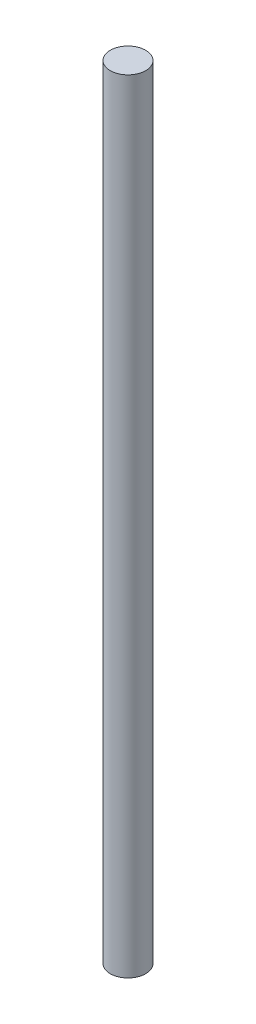
ISO-10303-21;
HEADER;
FILE_DESCRIPTION(('STEP AP214'),'2;1');
FILE_NAME('part.step','',(''),(''),'','','');
FILE_SCHEMA(('AUTOMOTIVE_DESIGN { 1 0 10303 214 1 1 1 1 }'));
ENDSEC;
DATA;
#1=APPLICATION_CONTEXT('core data for automotive mechanical design processes');
#2=APPLICATION_PROTOCOL_DEFINITION('international standard','automotive_design',2000,#1);
#3=PRODUCT_CONTEXT('',#1,'mechanical');
#4=PRODUCT('Part','Part','',(#3));
#5=PRODUCT_RELATED_PRODUCT_CATEGORY('part','',(#4));
#6=PRODUCT_DEFINITION_FORMATION('','',#4);
#7=PRODUCT_DEFINITION_CONTEXT('part definition',#1,'design');
#8=PRODUCT_DEFINITION('design','',#6,#7);
#9=PRODUCT_DEFINITION_SHAPE('','',#8);
#10=(LENGTH_UNIT() NAMED_UNIT(*) SI_UNIT(.MILLI.,.METRE.));
#11=(NAMED_UNIT(*) PLANE_ANGLE_UNIT() SI_UNIT($,.RADIAN.));
#12=(NAMED_UNIT(*) SI_UNIT($,.STERADIAN.) SOLID_ANGLE_UNIT());
#13=UNCERTAINTY_MEASURE_WITH_UNIT(LENGTH_MEASURE(1.E-05),#10,'distance_accuracy_value','');
#14=(GEOMETRIC_REPRESENTATION_CONTEXT(3) GLOBAL_UNCERTAINTY_ASSIGNED_CONTEXT((#13)) GLOBAL_UNIT_ASSIGNED_CONTEXT((#10,
#11,#12)) REPRESENTATION_CONTEXT('',''));
#15=CARTESIAN_POINT('',(0.,0.,0.));
#16=DIRECTION('',(0.,0.,1.));
#17=DIRECTION('',(1.,0.,0.));
#18=AXIS2_PLACEMENT_3D('',#15,#16,#17);
#19=CARTESIAN_POINT('',(0.,70.1869031593643,0.));
#20=DIRECTION('',(0.,-1.,0.));
#21=DIRECTION('',(0.,0.,-1.));
#22=AXIS2_PLACEMENT_3D('',#19,#20,#21);
#23=CYLINDRICAL_SURFACE('',#22,1.5875);
#24=CARTESIAN_POINT('',(0.,70.1869031593643,0.));
#25=DIRECTION('',(0.,1.,0.));
#26=DIRECTION('',(0.,0.,1.));
#27=AXIS2_PLACEMENT_3D('',#24,#25,#26);
#28=CIRCLE('',#27,1.5875);
#29=CARTESIAN_POINT('',(0.,70.1869031593643,1.5875));
#30=VERTEX_POINT('',#29);
#31=EDGE_CURVE('E10',#30,#30,#28,.T.);
#32=ORIENTED_EDGE('',*,*,#31,.F.);
#33=EDGE_LOOP('',(#32));
#34=FACE_BOUND('',#33,.T.);
#35=CARTESIAN_POINT('',(0.,0.,0.));
#36=DIRECTION('',(0.,1.,0.));
#37=DIRECTION('',(0.,0.,1.));
#38=AXIS2_PLACEMENT_3D('',#35,#36,#37);
#39=CIRCLE('',#38,1.5875);
#40=CARTESIAN_POINT('',(0.,0.,1.5875));
#41=VERTEX_POINT('',#40);
#42=EDGE_CURVE('E46',#41,#41,#39,.T.);
#43=ORIENTED_EDGE('',*,*,#42,.T.);
#44=EDGE_LOOP('',(#43));
#45=FACE_BOUND('',#44,.T.);
#46=ADVANCED_FACE('F43',(#34,#45),#23,.T.);
#47=CARTESIAN_POINT('',(0.,70.1869031593643,0.));
#48=DIRECTION('',(0.,1.,0.));
#49=DIRECTION('',(0.,0.,1.));
#50=AXIS2_PLACEMENT_3D('',#47,#48,#49);
#51=PLANE('',#50);
#52=ORIENTED_EDGE('',*,*,#31,.T.);
#53=EDGE_LOOP('',(#52));
#54=FACE_BOUND('',#53,.T.);
#55=ADVANCED_FACE('F59',(#54),#51,.T.);
#56=CARTESIAN_POINT('',(0.,0.,0.));
#57=DIRECTION('',(0.,1.,0.));
#58=DIRECTION('',(0.,0.,1.));
#59=AXIS2_PLACEMENT_3D('',#56,#57,#58);
#60=PLANE('',#59);
#61=ORIENTED_EDGE('',*,*,#42,.F.);
#62=EDGE_LOOP('',(#61));
#63=FACE_BOUND('',#62,.T.);
#64=ADVANCED_FACE('F57',(#63),#60,.F.);
#65=CLOSED_SHELL('',(#46,#55,#64));
#66=MANIFOLD_SOLID_BREP('B2',#65);
#67=ADVANCED_BREP_SHAPE_REPRESENTATION('',(#18,#66),#14);
#68=SHAPE_DEFINITION_REPRESENTATION(#9,#67);
ENDSEC;
END-ISO-10303-21;
